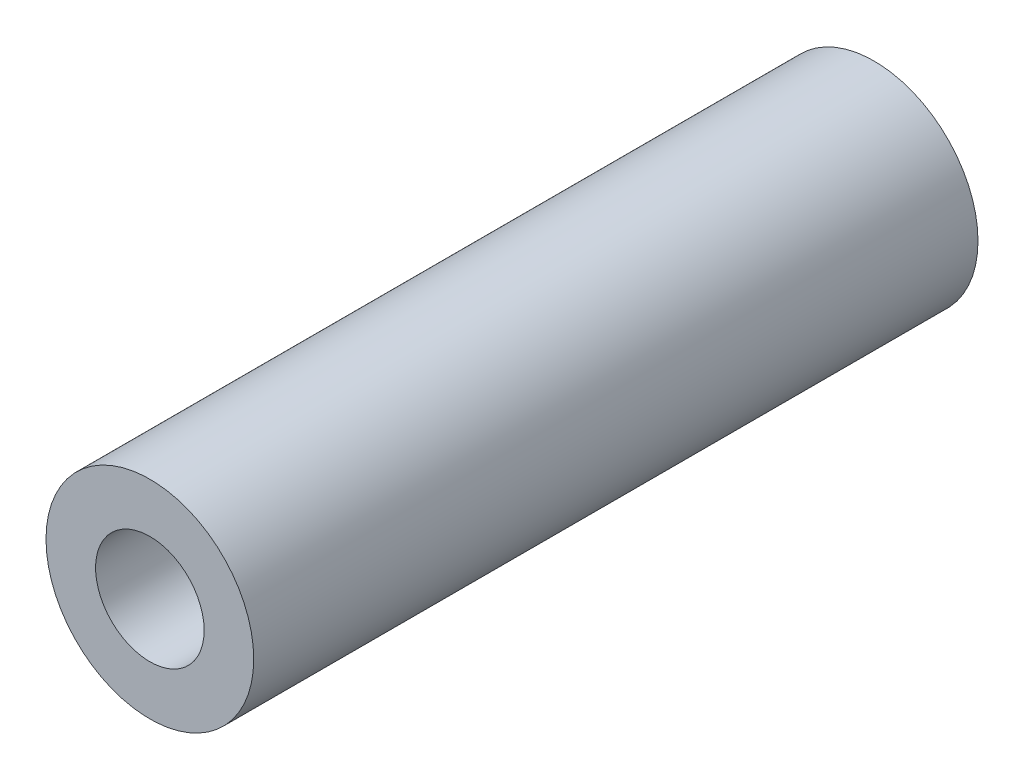
ISO-10303-21;
HEADER;
FILE_DESCRIPTION(('STEP AP214'),'2;1');
FILE_NAME('part.step','',(''),(''),'','','');
FILE_SCHEMA(('AUTOMOTIVE_DESIGN { 1 0 10303 214 1 1 1 1 }'));
ENDSEC;
DATA;
#1=APPLICATION_CONTEXT('core data for automotive mechanical design processes');
#2=APPLICATION_PROTOCOL_DEFINITION('international standard','automotive_design',2000,#1);
#3=PRODUCT_CONTEXT('',#1,'mechanical');
#4=PRODUCT('Part','Part','',(#3));
#5=PRODUCT_RELATED_PRODUCT_CATEGORY('part','',(#4));
#6=PRODUCT_DEFINITION_FORMATION('','',#4);
#7=PRODUCT_DEFINITION_CONTEXT('part definition',#1,'design');
#8=PRODUCT_DEFINITION('design','',#6,#7);
#9=PRODUCT_DEFINITION_SHAPE('','',#8);
#10=(LENGTH_UNIT() NAMED_UNIT(*) SI_UNIT(.MILLI.,.METRE.));
#11=(NAMED_UNIT(*) PLANE_ANGLE_UNIT() SI_UNIT($,.RADIAN.));
#12=(NAMED_UNIT(*) SI_UNIT($,.STERADIAN.) SOLID_ANGLE_UNIT());
#13=UNCERTAINTY_MEASURE_WITH_UNIT(LENGTH_MEASURE(1.E-05),#10,'distance_accuracy_value','');
#14=(GEOMETRIC_REPRESENTATION_CONTEXT(3) GLOBAL_UNCERTAINTY_ASSIGNED_CONTEXT((#13)) GLOBAL_UNIT_ASSIGNED_CONTEXT((#10,
#11,#12)) REPRESENTATION_CONTEXT('',''));
#15=CARTESIAN_POINT('',(0.,0.,0.));
#16=DIRECTION('',(0.,0.,1.));
#17=DIRECTION('',(1.,0.,0.));
#18=AXIS2_PLACEMENT_3D('',#15,#16,#17);
#19=CARTESIAN_POINT('',(0.,0.,16.60525));
#20=DIRECTION('',(0.,0.,-1.));
#21=DIRECTION('',(-1.,0.,0.));
#22=AXIS2_PLACEMENT_3D('',#19,#20,#21);
#23=CYLINDRICAL_SURFACE('',#22,4.7625);
#24=CARTESIAN_POINT('',(0.,0.,16.60525));
#25=DIRECTION('',(0.,0.,1.));
#26=DIRECTION('',(1.,0.,0.));
#27=AXIS2_PLACEMENT_3D('',#24,#25,#26);
#28=CIRCLE('',#27,4.7625);
#29=CARTESIAN_POINT('',(4.7625,0.,16.60525));
#30=VERTEX_POINT('',#29);
#31=EDGE_CURVE('E10',#30,#30,#28,.T.);
#32=ORIENTED_EDGE('',*,*,#31,.F.);
#33=EDGE_LOOP('',(#32));
#34=FACE_BOUND('',#33,.T.);
#35=CARTESIAN_POINT('',(0.,0.,-16.60525));
#36=DIRECTION('',(0.,0.,1.));
#37=DIRECTION('',(1.,0.,0.));
#38=AXIS2_PLACEMENT_3D('',#35,#36,#37);
#39=CIRCLE('',#38,4.7625);
#40=CARTESIAN_POINT('',(4.7625,0.,-16.60525));
#41=VERTEX_POINT('',#40);
#42=EDGE_CURVE('E46',#41,#41,#39,.T.);
#43=ORIENTED_EDGE('',*,*,#42,.T.);
#44=EDGE_LOOP('',(#43));
#45=FACE_BOUND('',#44,.T.);
#46=ADVANCED_FACE('F43',(#34,#45),#23,.T.);
#47=CARTESIAN_POINT('',(0.,0.,16.60525));
#48=DIRECTION('',(0.,0.,1.));
#49=DIRECTION('',(1.,0.,0.));
#50=AXIS2_PLACEMENT_3D('',#47,#48,#49);
#51=PLANE('',#50);
#52=CARTESIAN_POINT('',(0.,0.,16.60525));
#53=DIRECTION('',(0.,0.,1.));
#54=DIRECTION('',(1.,0.,0.));
#55=AXIS2_PLACEMENT_3D('',#52,#53,#54);
#56=CIRCLE('',#55,2.4892);
#57=CARTESIAN_POINT('',(2.4892,0.,16.60525));
#58=VERTEX_POINT('',#57);
#59=EDGE_CURVE('E57',#58,#58,#56,.T.);
#60=ORIENTED_EDGE('',*,*,#59,.F.);
#61=EDGE_LOOP('',(#60));
#62=FACE_BOUND('',#61,.T.);
#63=ORIENTED_EDGE('',*,*,#31,.T.);
#64=EDGE_LOOP('',(#63));
#65=FACE_BOUND('',#64,.T.);
#66=ADVANCED_FACE('F74',(#62,#65),#51,.T.);
#67=CARTESIAN_POINT('',(0.,0.,-16.60525));
#68=DIRECTION('',(0.,0.,1.));
#69=DIRECTION('',(1.,0.,0.));
#70=AXIS2_PLACEMENT_3D('',#67,#68,#69);
#71=PLANE('',#70);
#72=CARTESIAN_POINT('',(0.,0.,-16.60525));
#73=DIRECTION('',(0.,0.,1.));
#74=DIRECTION('',(1.,0.,0.));
#75=AXIS2_PLACEMENT_3D('',#72,#73,#74);
#76=CIRCLE('',#75,2.4892);
#77=CARTESIAN_POINT('',(2.4892,0.,-16.60525));
#78=VERTEX_POINT('',#77);
#79=EDGE_CURVE('E55',#78,#78,#76,.T.);
#80=ORIENTED_EDGE('',*,*,#79,.T.);
#81=EDGE_LOOP('',(#80));
#82=FACE_BOUND('',#81,.T.);
#83=ORIENTED_EDGE('',*,*,#42,.F.);
#84=EDGE_LOOP('',(#83));
#85=FACE_BOUND('',#84,.T.);
#86=ADVANCED_FACE('F65',(#82,#85),#71,.F.);
#87=CARTESIAN_POINT('',(0.,0.,-16.60525));
#88=DIRECTION('',(0.,0.,1.));
#89=DIRECTION('',(1.,0.,0.));
#90=AXIS2_PLACEMENT_3D('',#87,#88,#89);
#91=CYLINDRICAL_SURFACE('',#90,2.4892);
#92=ORIENTED_EDGE('',*,*,#79,.F.);
#93=EDGE_LOOP('',(#92));
#94=FACE_BOUND('',#93,.T.);
#95=ORIENTED_EDGE('',*,*,#59,.T.);
#96=EDGE_LOOP('',(#95));
#97=FACE_BOUND('',#96,.T.);
#98=ADVANCED_FACE('F68',(#94,#97),#91,.F.);
#99=CLOSED_SHELL('',(#46,#66,#86,#98));
#100=MANIFOLD_SOLID_BREP('B2',#99);
#101=ADVANCED_BREP_SHAPE_REPRESENTATION('',(#18,#100),#14);
#102=SHAPE_DEFINITION_REPRESENTATION(#9,#101);
ENDSEC;
END-ISO-10303-21;
